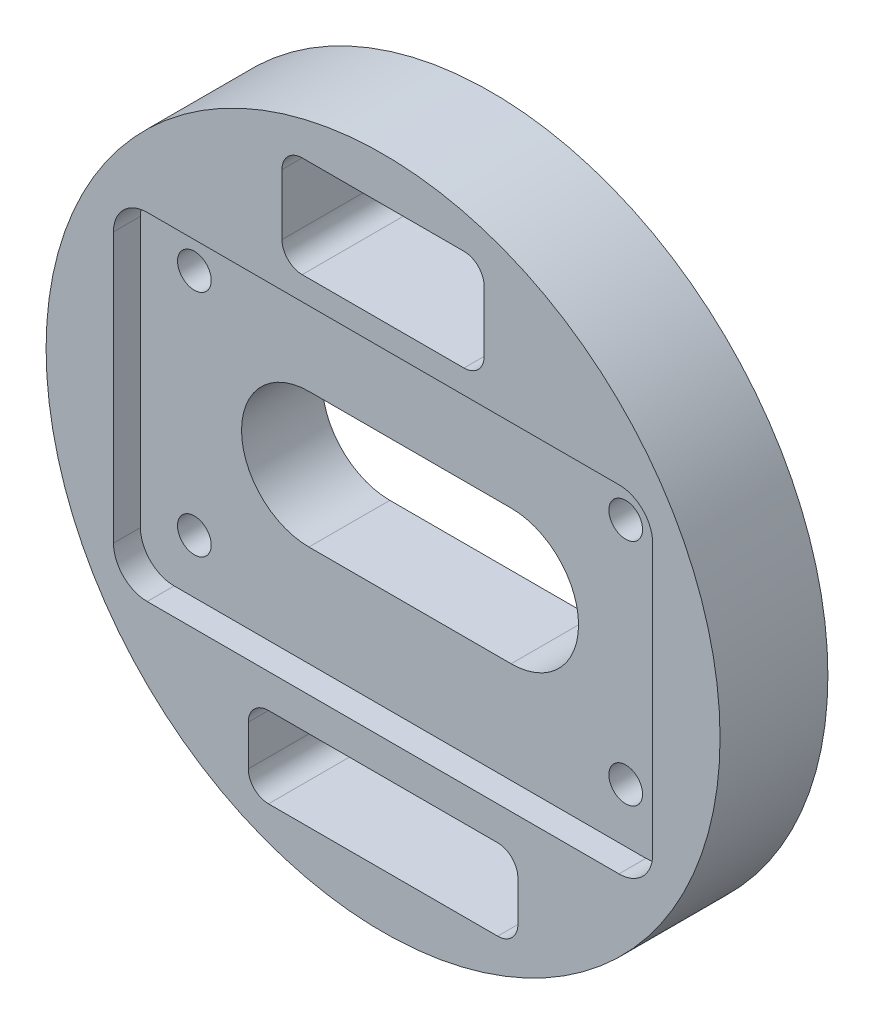
ISO-10303-21;
HEADER;
FILE_DESCRIPTION(('STEP AP214'),'2;1');
FILE_NAME('part.step','',(''),(''),'','','');
FILE_SCHEMA(('AUTOMOTIVE_DESIGN { 1 0 10303 214 1 1 1 1 }'));
ENDSEC;
DATA;
#1=APPLICATION_CONTEXT('core data for automotive mechanical design processes');
#2=APPLICATION_PROTOCOL_DEFINITION('international standard','automotive_design',2000,#1);
#3=PRODUCT_CONTEXT('',#1,'mechanical');
#4=PRODUCT('Part','Part','',(#3));
#5=PRODUCT_RELATED_PRODUCT_CATEGORY('part','',(#4));
#6=PRODUCT_DEFINITION_FORMATION('','',#4);
#7=PRODUCT_DEFINITION_CONTEXT('part definition',#1,'design');
#8=PRODUCT_DEFINITION('design','',#6,#7);
#9=PRODUCT_DEFINITION_SHAPE('','',#8);
#10=(LENGTH_UNIT() NAMED_UNIT(*) SI_UNIT(.MILLI.,.METRE.));
#11=(NAMED_UNIT(*) PLANE_ANGLE_UNIT() SI_UNIT($,.RADIAN.));
#12=(NAMED_UNIT(*) SI_UNIT($,.STERADIAN.) SOLID_ANGLE_UNIT());
#13=UNCERTAINTY_MEASURE_WITH_UNIT(LENGTH_MEASURE(1.E-05),#10,'distance_accuracy_value','');
#14=(GEOMETRIC_REPRESENTATION_CONTEXT(3) GLOBAL_UNCERTAINTY_ASSIGNED_CONTEXT((#13)) GLOBAL_UNIT_ASSIGNED_CONTEXT((#10,
#11,#12)) REPRESENTATION_CONTEXT('',''));
#15=CARTESIAN_POINT('',(0.,0.,0.));
#16=DIRECTION('',(0.,0.,1.));
#17=DIRECTION('',(1.,0.,0.));
#18=AXIS2_PLACEMENT_3D('',#15,#16,#17);
#19=CARTESIAN_POINT('',(0.,0.,-8.));
#20=DIRECTION('',(0.,0.,1.));
#21=DIRECTION('',(1.,0.,0.));
#22=AXIS2_PLACEMENT_3D('',#19,#20,#21);
#23=CYLINDRICAL_SURFACE('',#22,25.);
#24=CARTESIAN_POINT('',(0.,0.,-8.));
#25=DIRECTION('',(0.,0.,1.));
#26=DIRECTION('',(1.,0.,0.));
#27=AXIS2_PLACEMENT_3D('',#24,#25,#26);
#28=CIRCLE('',#27,25.);
#29=CARTESIAN_POINT('',(25.,0.,-8.));
#30=VERTEX_POINT('',#29);
#31=EDGE_CURVE('E497',#30,#30,#28,.T.);
#32=ORIENTED_EDGE('',*,*,#31,.T.);
#33=EDGE_LOOP('',(#32));
#34=FACE_BOUND('',#33,.T.);
#35=CARTESIAN_POINT('',(0.,0.,0.));
#36=DIRECTION('',(0.,0.,1.));
#37=DIRECTION('',(1.,0.,0.));
#38=AXIS2_PLACEMENT_3D('',#35,#36,#37);
#39=CIRCLE('',#38,25.);
#40=CARTESIAN_POINT('',(25.,0.,0.));
#41=VERTEX_POINT('',#40);
#42=EDGE_CURVE('E475',#41,#41,#39,.T.);
#43=ORIENTED_EDGE('',*,*,#42,.F.);
#44=EDGE_LOOP('',(#43));
#45=FACE_BOUND('',#44,.T.);
#46=ADVANCED_FACE('F43',(#34,#45),#23,.T.);
#47=CARTESIAN_POINT('',(0.,0.,-8.));
#48=DIRECTION('',(0.,0.,1.));
#49=DIRECTION('',(1.,0.,0.));
#50=AXIS2_PLACEMENT_3D('',#47,#48,#49);
#51=PLANE('',#50);
#52=DIRECTION('',(0.,-1.,0.));
#53=VECTOR('',#52,1.);
#54=CARTESIAN_POINT('',(-9.99999999999999,-21.,-8.));
#55=LINE('',#54,#53);
#56=CARTESIAN_POINT('',(-9.99999999999999,-16.5,-8.));
#57=VERTEX_POINT('',#56);
#58=CARTESIAN_POINT('',(-9.99999999999999,-19.5,-8.));
#59=VERTEX_POINT('',#58);
#60=EDGE_CURVE('E570',#57,#59,#55,.T.);
#61=ORIENTED_EDGE('',*,*,#60,.T.);
#62=CARTESIAN_POINT('',(-8.49999999999999,-19.5,-8.));
#63=DIRECTION('',(0.,0.,1.));
#64=DIRECTION('',(1.,0.,0.));
#65=AXIS2_PLACEMENT_3D('',#62,#63,#64);
#66=CIRCLE('',#65,1.5);
#67=CARTESIAN_POINT('',(-8.49999999999999,-21.,-8.));
#68=VERTEX_POINT('',#67);
#69=EDGE_CURVE('E540',#59,#68,#66,.T.);
#70=ORIENTED_EDGE('',*,*,#69,.T.);
#71=DIRECTION('',(1.,0.,0.));
#72=VECTOR('',#71,1.);
#73=CARTESIAN_POINT('',(-9.99999999999999,-21.,-8.));
#74=LINE('',#73,#72);
#75=CARTESIAN_POINT('',(8.50000000000001,-21.,-8.));
#76=VERTEX_POINT('',#75);
#77=EDGE_CURVE('E290',#68,#76,#74,.T.);
#78=ORIENTED_EDGE('',*,*,#77,.T.);
#79=CARTESIAN_POINT('',(8.50000000000001,-19.5,-8.));
#80=DIRECTION('',(0.,0.,1.));
#81=DIRECTION('',(1.,0.,0.));
#82=AXIS2_PLACEMENT_3D('',#79,#80,#81);
#83=CIRCLE('',#82,1.5);
#84=CARTESIAN_POINT('',(10.,-19.5,-8.));
#85=VERTEX_POINT('',#84);
#86=EDGE_CURVE('E534',#76,#85,#83,.T.);
#87=ORIENTED_EDGE('',*,*,#86,.T.);
#88=DIRECTION('',(0.,1.,0.));
#89=VECTOR('',#88,1.);
#90=CARTESIAN_POINT('',(10.,-21.,-8.));
#91=LINE('',#90,#89);
#92=CARTESIAN_POINT('',(10.,-16.5,-8.));
#93=VERTEX_POINT('',#92);
#94=EDGE_CURVE('E571',#85,#93,#91,.T.);
#95=ORIENTED_EDGE('',*,*,#94,.T.);
#96=CARTESIAN_POINT('',(8.50000000000001,-16.5,-8.));
#97=DIRECTION('',(0.,0.,1.));
#98=DIRECTION('',(1.,0.,0.));
#99=AXIS2_PLACEMENT_3D('',#96,#97,#98);
#100=CIRCLE('',#99,1.5);
#101=CARTESIAN_POINT('',(8.50000000000001,-15.,-8.));
#102=VERTEX_POINT('',#101);
#103=EDGE_CURVE('E11',#93,#102,#100,.T.);
#104=ORIENTED_EDGE('',*,*,#103,.T.);
#105=DIRECTION('',(-1.,0.,0.));
#106=VECTOR('',#105,1.);
#107=CARTESIAN_POINT('',(-9.99999999999999,-15.,-8.));
#108=LINE('',#107,#106);
#109=CARTESIAN_POINT('',(-8.49999999999999,-15.,-8.));
#110=VERTEX_POINT('',#109);
#111=EDGE_CURVE('E567',#102,#110,#108,.T.);
#112=ORIENTED_EDGE('',*,*,#111,.T.);
#113=CARTESIAN_POINT('',(-8.49999999999999,-16.5,-8.));
#114=DIRECTION('',(0.,0.,1.));
#115=DIRECTION('',(1.,0.,0.));
#116=AXIS2_PLACEMENT_3D('',#113,#114,#115);
#117=CIRCLE('',#116,1.5);
#118=EDGE_CURVE('E546',#110,#57,#117,.T.);
#119=ORIENTED_EDGE('',*,*,#118,.T.);
#120=EDGE_LOOP('',(#61,#70,#78,#87,#95,#104,#112,#119));
#121=FACE_BOUND('',#120,.T.);
#122=DIRECTION('',(1.,0.,0.));
#123=VECTOR('',#122,1.);
#124=CARTESIAN_POINT('',(6.,14.25,-8.));
#125=LINE('',#124,#123);
#126=CARTESIAN_POINT('',(-6.,14.25,-8.));
#127=VERTEX_POINT('',#126);
#128=CARTESIAN_POINT('',(6.,14.25,-8.));
#129=VERTEX_POINT('',#128);
#130=EDGE_CURVE('E242',#127,#129,#125,.T.);
#131=ORIENTED_EDGE('',*,*,#130,.T.);
#132=CARTESIAN_POINT('',(6.,15.75,-8.));
#133=DIRECTION('',(0.,0.,1.));
#134=DIRECTION('',(-1.,0.,0.));
#135=AXIS2_PLACEMENT_3D('',#132,#133,#134);
#136=CIRCLE('',#135,1.5);
#137=CARTESIAN_POINT('',(7.5,15.75,-8.));
#138=VERTEX_POINT('',#137);
#139=EDGE_CURVE('E233',#129,#138,#136,.T.);
#140=ORIENTED_EDGE('',*,*,#139,.T.);
#141=DIRECTION('',(0.,1.,0.));
#142=VECTOR('',#141,1.);
#143=CARTESIAN_POINT('',(7.5,20.25,-8.));
#144=LINE('',#143,#142);
#145=CARTESIAN_POINT('',(7.5,20.25,-8.));
#146=VERTEX_POINT('',#145);
#147=EDGE_CURVE('E246',#138,#146,#144,.T.);
#148=ORIENTED_EDGE('',*,*,#147,.T.);
#149=CARTESIAN_POINT('',(6.,20.25,-8.));
#150=DIRECTION('',(0.,0.,1.));
#151=DIRECTION('',(-1.,0.,0.));
#152=AXIS2_PLACEMENT_3D('',#149,#150,#151);
#153=CIRCLE('',#152,1.5);
#154=CARTESIAN_POINT('',(6.,21.75,-8.));
#155=VERTEX_POINT('',#154);
#156=EDGE_CURVE('E251',#146,#155,#153,.T.);
#157=ORIENTED_EDGE('',*,*,#156,.T.);
#158=DIRECTION('',(-1.,0.,0.));
#159=VECTOR('',#158,1.);
#160=CARTESIAN_POINT('',(6.,21.75,-8.));
#161=LINE('',#160,#159);
#162=CARTESIAN_POINT('',(-6.,21.75,-8.));
#163=VERTEX_POINT('',#162);
#164=EDGE_CURVE('E270',#155,#163,#161,.T.);
#165=ORIENTED_EDGE('',*,*,#164,.T.);
#166=CARTESIAN_POINT('',(-6.,20.25,-8.));
#167=DIRECTION('',(0.,0.,1.));
#168=DIRECTION('',(1.,0.,0.));
#169=AXIS2_PLACEMENT_3D('',#166,#167,#168);
#170=CIRCLE('',#169,1.5);
#171=CARTESIAN_POINT('',(-7.5,20.25,-8.));
#172=VERTEX_POINT('',#171);
#173=EDGE_CURVE('E274',#163,#172,#170,.T.);
#174=ORIENTED_EDGE('',*,*,#173,.T.);
#175=DIRECTION('',(0.,-1.,0.));
#176=VECTOR('',#175,1.);
#177=CARTESIAN_POINT('',(-7.5,20.25,-8.));
#178=LINE('',#177,#176);
#179=CARTESIAN_POINT('',(-7.5,15.75,-8.));
#180=VERTEX_POINT('',#179);
#181=EDGE_CURVE('E278',#172,#180,#178,.T.);
#182=ORIENTED_EDGE('',*,*,#181,.T.);
#183=CARTESIAN_POINT('',(-6.,15.75,-8.));
#184=DIRECTION('',(0.,0.,1.));
#185=DIRECTION('',(-1.,0.,0.));
#186=AXIS2_PLACEMENT_3D('',#183,#184,#185);
#187=CIRCLE('',#186,1.5);
#188=EDGE_CURVE('E282',#180,#127,#187,.T.);
#189=ORIENTED_EDGE('',*,*,#188,.T.);
#190=EDGE_LOOP('',(#131,#140,#148,#157,#165,#174,#182,#189));
#191=FACE_BOUND('',#190,.T.);
#192=CARTESIAN_POINT('',(16.,8.50000000000001,-8.));
#193=DIRECTION('',(0.,0.,1.));
#194=DIRECTION('',(1.,0.,0.));
#195=AXIS2_PLACEMENT_3D('',#192,#193,#194);
#196=CIRCLE('',#195,1.25);
#197=CARTESIAN_POINT('',(17.25,8.50000000000001,-8.));
#198=VERTEX_POINT('',#197);
#199=EDGE_CURVE('E336',#198,#198,#196,.T.);
#200=ORIENTED_EDGE('',*,*,#199,.T.);
#201=EDGE_LOOP('',(#200));
#202=FACE_BOUND('',#201,.T.);
#203=CARTESIAN_POINT('',(-16.,8.50000000000001,-8.));
#204=DIRECTION('',(0.,0.,1.));
#205=DIRECTION('',(1.,0.,0.));
#206=AXIS2_PLACEMENT_3D('',#203,#204,#205);
#207=CIRCLE('',#206,1.25);
#208=CARTESIAN_POINT('',(-14.75,8.50000000000001,-8.));
#209=VERTEX_POINT('',#208);
#210=EDGE_CURVE('E344',#209,#209,#207,.T.);
#211=ORIENTED_EDGE('',*,*,#210,.T.);
#212=EDGE_LOOP('',(#211));
#213=FACE_BOUND('',#212,.T.);
#214=CARTESIAN_POINT('',(-16.,-8.50000000000001,-8.));
#215=DIRECTION('',(0.,0.,1.));
#216=DIRECTION('',(1.,0.,0.));
#217=AXIS2_PLACEMENT_3D('',#214,#215,#216);
#218=CIRCLE('',#217,1.25);
#219=CARTESIAN_POINT('',(-14.75,-8.50000000000001,-8.));
#220=VERTEX_POINT('',#219);
#221=EDGE_CURVE('E352',#220,#220,#218,.T.);
#222=ORIENTED_EDGE('',*,*,#221,.T.);
#223=EDGE_LOOP('',(#222));
#224=FACE_BOUND('',#223,.T.);
#225=CARTESIAN_POINT('',(16.,-8.50000000000001,-8.));
#226=DIRECTION('',(0.,0.,1.));
#227=DIRECTION('',(1.,0.,0.));
#228=AXIS2_PLACEMENT_3D('',#225,#226,#227);
#229=CIRCLE('',#228,1.25);
#230=CARTESIAN_POINT('',(17.25,-8.50000000000001,-8.));
#231=VERTEX_POINT('',#230);
#232=EDGE_CURVE('E360',#231,#231,#229,.T.);
#233=ORIENTED_EDGE('',*,*,#232,.T.);
#234=EDGE_LOOP('',(#233));
#235=FACE_BOUND('',#234,.T.);
#236=DIRECTION('',(-1.,0.,0.));
#237=VECTOR('',#236,1.);
#238=CARTESIAN_POINT('',(-7.5,5.,-8.));
#239=LINE('',#238,#237);
#240=CARTESIAN_POINT('',(7.5,5.,-8.));
#241=VERTEX_POINT('',#240);
#242=CARTESIAN_POINT('',(-7.5,5.,-8.));
#243=VERTEX_POINT('',#242);
#244=EDGE_CURVE('E378',#241,#243,#239,.T.);
#245=ORIENTED_EDGE('',*,*,#244,.T.);
#246=CARTESIAN_POINT('',(-7.5,0.,-8.));
#247=DIRECTION('',(0.,0.,1.));
#248=DIRECTION('',(1.,0.,0.));
#249=AXIS2_PLACEMENT_3D('',#246,#247,#248);
#250=CIRCLE('',#249,5.);
#251=CARTESIAN_POINT('',(-7.5,-5.,-8.));
#252=VERTEX_POINT('',#251);
#253=EDGE_CURVE('E365',#243,#252,#250,.T.);
#254=ORIENTED_EDGE('',*,*,#253,.T.);
#255=DIRECTION('',(1.,0.,0.));
#256=VECTOR('',#255,1.);
#257=CARTESIAN_POINT('',(-7.5,-5.,-8.));
#258=LINE('',#257,#256);
#259=CARTESIAN_POINT('',(7.5,-5.,-8.));
#260=VERTEX_POINT('',#259);
#261=EDGE_CURVE('E369',#252,#260,#258,.T.);
#262=ORIENTED_EDGE('',*,*,#261,.T.);
#263=CARTESIAN_POINT('',(7.5,0.,-8.));
#264=DIRECTION('',(0.,0.,1.));
#265=DIRECTION('',(1.,0.,0.));
#266=AXIS2_PLACEMENT_3D('',#263,#264,#265);
#267=CIRCLE('',#266,5.);
#268=EDGE_CURVE('E374',#260,#241,#267,.T.);
#269=ORIENTED_EDGE('',*,*,#268,.T.);
#270=EDGE_LOOP('',(#245,#254,#262,#269));
#271=FACE_BOUND('',#270,.T.);
#272=ORIENTED_EDGE('',*,*,#31,.F.);
#273=EDGE_LOOP('',(#272));
#274=FACE_BOUND('',#273,.T.);
#275=ADVANCED_FACE('F253',(#121,#191,#202,#213,#224,#235,#271,#274),#51,.F.);
#276=CARTESIAN_POINT('',(0.,0.,0.));
#277=DIRECTION('',(0.,0.,1.));
#278=DIRECTION('',(1.,0.,0.));
#279=AXIS2_PLACEMENT_3D('',#276,#277,#278);
#280=PLANE('',#279);
#281=DIRECTION('',(0.,1.,0.));
#282=VECTOR('',#281,1.);
#283=CARTESIAN_POINT('',(10.,-21.,0.));
#284=LINE('',#283,#282);
#285=CARTESIAN_POINT('',(10.,-19.5,0.));
#286=VERTEX_POINT('',#285);
#287=CARTESIAN_POINT('',(10.,-16.5,0.));
#288=VERTEX_POINT('',#287);
#289=EDGE_CURVE('E555',#286,#288,#284,.T.);
#290=ORIENTED_EDGE('',*,*,#289,.F.);
#291=CARTESIAN_POINT('',(8.50000000000001,-19.5,0.));
#292=DIRECTION('',(0.,0.,1.));
#293=DIRECTION('',(1.,0.,0.));
#294=AXIS2_PLACEMENT_3D('',#291,#292,#293);
#295=CIRCLE('',#294,1.5);
#296=CARTESIAN_POINT('',(8.50000000000001,-21.,0.));
#297=VERTEX_POINT('',#296);
#298=EDGE_CURVE('E531',#286,#297,#295,.F.);
#299=ORIENTED_EDGE('',*,*,#298,.T.);
#300=DIRECTION('',(1.,0.,0.));
#301=VECTOR('',#300,1.);
#302=CARTESIAN_POINT('',(-9.99999999999999,-21.,0.));
#303=LINE('',#302,#301);
#304=CARTESIAN_POINT('',(-8.49999999999999,-21.,0.));
#305=VERTEX_POINT('',#304);
#306=EDGE_CURVE('E265',#305,#297,#303,.T.);
#307=ORIENTED_EDGE('',*,*,#306,.F.);
#308=CARTESIAN_POINT('',(-8.49999999999999,-19.5,0.));
#309=DIRECTION('',(0.,0.,1.));
#310=DIRECTION('',(1.,0.,0.));
#311=AXIS2_PLACEMENT_3D('',#308,#309,#310);
#312=CIRCLE('',#311,1.5);
#313=CARTESIAN_POINT('',(-9.99999999999999,-19.5,0.));
#314=VERTEX_POINT('',#313);
#315=EDGE_CURVE('E537',#305,#314,#312,.F.);
#316=ORIENTED_EDGE('',*,*,#315,.T.);
#317=DIRECTION('',(0.,-1.,0.));
#318=VECTOR('',#317,1.);
#319=CARTESIAN_POINT('',(-9.99999999999999,-21.,0.));
#320=LINE('',#319,#318);
#321=CARTESIAN_POINT('',(-9.99999999999999,-16.5,0.));
#322=VERTEX_POINT('',#321);
#323=EDGE_CURVE('E583',#322,#314,#320,.T.);
#324=ORIENTED_EDGE('',*,*,#323,.F.);
#325=CARTESIAN_POINT('',(-8.49999999999999,-16.5,0.));
#326=DIRECTION('',(0.,0.,1.));
#327=DIRECTION('',(1.,0.,0.));
#328=AXIS2_PLACEMENT_3D('',#325,#326,#327);
#329=CIRCLE('',#328,1.5);
#330=CARTESIAN_POINT('',(-8.49999999999999,-15.,0.));
#331=VERTEX_POINT('',#330);
#332=EDGE_CURVE('E543',#322,#331,#329,.F.);
#333=ORIENTED_EDGE('',*,*,#332,.T.);
#334=DIRECTION('',(-1.,0.,0.));
#335=VECTOR('',#334,1.);
#336=CARTESIAN_POINT('',(-9.99999999999999,-15.,0.));
#337=LINE('',#336,#335);
#338=CARTESIAN_POINT('',(8.50000000000001,-15.,0.));
#339=VERTEX_POINT('',#338);
#340=EDGE_CURVE('E556',#339,#331,#337,.T.);
#341=ORIENTED_EDGE('',*,*,#340,.F.);
#342=CARTESIAN_POINT('',(8.50000000000001,-16.5,0.));
#343=DIRECTION('',(0.,0.,1.));
#344=DIRECTION('',(1.,0.,0.));
#345=AXIS2_PLACEMENT_3D('',#342,#343,#344);
#346=CIRCLE('',#345,1.5);
#347=EDGE_CURVE('E52',#339,#288,#346,.F.);
#348=ORIENTED_EDGE('',*,*,#347,.T.);
#349=EDGE_LOOP('',(#290,#299,#307,#316,#324,#333,#341,#348));
#350=FACE_BOUND('',#349,.T.);
#351=CARTESIAN_POINT('',(6.,15.75,0.));
#352=DIRECTION('',(0.,0.,1.));
#353=DIRECTION('',(-1.,0.,0.));
#354=AXIS2_PLACEMENT_3D('',#351,#352,#353);
#355=CIRCLE('',#354,1.5);
#356=CARTESIAN_POINT('',(6.,14.25,0.));
#357=VERTEX_POINT('',#356);
#358=CARTESIAN_POINT('',(7.5,15.75,0.));
#359=VERTEX_POINT('',#358);
#360=EDGE_CURVE('E236',#357,#359,#355,.T.);
#361=ORIENTED_EDGE('',*,*,#360,.F.);
#362=DIRECTION('',(1.,0.,0.));
#363=VECTOR('',#362,1.);
#364=CARTESIAN_POINT('',(6.,14.25,0.));
#365=LINE('',#364,#363);
#366=CARTESIAN_POINT('',(-6.,14.25,0.));
#367=VERTEX_POINT('',#366);
#368=EDGE_CURVE('E258',#367,#357,#365,.T.);
#369=ORIENTED_EDGE('',*,*,#368,.F.);
#370=CARTESIAN_POINT('',(-6.,15.75,0.));
#371=DIRECTION('',(0.,0.,1.));
#372=DIRECTION('',(-1.,0.,0.));
#373=AXIS2_PLACEMENT_3D('',#370,#371,#372);
#374=CIRCLE('',#373,1.5);
#375=CARTESIAN_POINT('',(-7.5,15.75,0.));
#376=VERTEX_POINT('',#375);
#377=EDGE_CURVE('E262',#376,#367,#374,.T.);
#378=ORIENTED_EDGE('',*,*,#377,.F.);
#379=DIRECTION('',(0.,-1.,0.));
#380=VECTOR('',#379,1.);
#381=CARTESIAN_POINT('',(-7.5,20.25,0.));
#382=LINE('',#381,#380);
#383=CARTESIAN_POINT('',(-7.5,20.25,0.));
#384=VERTEX_POINT('',#383);
#385=EDGE_CURVE('E305',#384,#376,#382,.T.);
#386=ORIENTED_EDGE('',*,*,#385,.F.);
#387=CARTESIAN_POINT('',(-6.,20.25,0.));
#388=DIRECTION('',(0.,0.,1.));
#389=DIRECTION('',(1.,0.,0.));
#390=AXIS2_PLACEMENT_3D('',#387,#388,#389);
#391=CIRCLE('',#390,1.5);
#392=CARTESIAN_POINT('',(-6.,21.75,0.));
#393=VERTEX_POINT('',#392);
#394=EDGE_CURVE('E301',#393,#384,#391,.T.);
#395=ORIENTED_EDGE('',*,*,#394,.F.);
#396=DIRECTION('',(-1.,0.,0.));
#397=VECTOR('',#396,1.);
#398=CARTESIAN_POINT('',(6.,21.75,0.));
#399=LINE('',#398,#397);
#400=CARTESIAN_POINT('',(6.,21.75,0.));
#401=VERTEX_POINT('',#400);
#402=EDGE_CURVE('E297',#401,#393,#399,.T.);
#403=ORIENTED_EDGE('',*,*,#402,.F.);
#404=CARTESIAN_POINT('',(6.,20.25,0.));
#405=DIRECTION('',(0.,0.,1.));
#406=DIRECTION('',(-1.,0.,0.));
#407=AXIS2_PLACEMENT_3D('',#404,#405,#406);
#408=CIRCLE('',#407,1.5);
#409=CARTESIAN_POINT('',(7.5,20.25,0.));
#410=VERTEX_POINT('',#409);
#411=EDGE_CURVE('E293',#410,#401,#408,.T.);
#412=ORIENTED_EDGE('',*,*,#411,.F.);
#413=DIRECTION('',(0.,1.,0.));
#414=VECTOR('',#413,1.);
#415=CARTESIAN_POINT('',(7.5,20.25,0.));
#416=LINE('',#415,#414);
#417=EDGE_CURVE('E289',#359,#410,#416,.T.);
#418=ORIENTED_EDGE('',*,*,#417,.F.);
#419=EDGE_LOOP('',(#361,#369,#378,#386,#395,#403,#412,#418));
#420=FACE_BOUND('',#419,.T.);
#421=CARTESIAN_POINT('',(17.5,-9.99999999999999,0.));
#422=DIRECTION('',(0.,0.,1.));
#423=DIRECTION('',(1.,0.,0.));
#424=AXIS2_PLACEMENT_3D('',#421,#422,#423);
#425=CIRCLE('',#424,2.5);
#426=CARTESIAN_POINT('',(17.5,-12.5,0.));
#427=VERTEX_POINT('',#426);
#428=CARTESIAN_POINT('',(20.,-9.99999999999999,0.));
#429=VERTEX_POINT('',#428);
#430=EDGE_CURVE('E399',#427,#429,#425,.T.);
#431=ORIENTED_EDGE('',*,*,#430,.F.);
#432=DIRECTION('',(1.,0.,0.));
#433=VECTOR('',#432,1.);
#434=CARTESIAN_POINT('',(-17.5,-12.5,0.));
#435=LINE('',#434,#433);
#436=CARTESIAN_POINT('',(-17.5,-12.5,0.));
#437=VERTEX_POINT('',#436);
#438=EDGE_CURVE('E414',#437,#427,#435,.T.);
#439=ORIENTED_EDGE('',*,*,#438,.F.);
#440=CARTESIAN_POINT('',(-17.5,-9.99999999999999,0.));
#441=DIRECTION('',(0.,0.,1.));
#442=DIRECTION('',(1.,0.,0.));
#443=AXIS2_PLACEMENT_3D('',#440,#441,#442);
#444=CIRCLE('',#443,2.5);
#445=CARTESIAN_POINT('',(-20.,-9.99999999999999,0.));
#446=VERTEX_POINT('',#445);
#447=EDGE_CURVE('E465',#446,#437,#444,.T.);
#448=ORIENTED_EDGE('',*,*,#447,.F.);
#449=DIRECTION('',(0.,-1.,0.));
#450=VECTOR('',#449,1.);
#451=CARTESIAN_POINT('',(-20.,10.,0.));
#452=LINE('',#451,#450);
#453=CARTESIAN_POINT('',(-20.,10.,0.));
#454=VERTEX_POINT('',#453);
#455=EDGE_CURVE('E461',#454,#446,#452,.T.);
#456=ORIENTED_EDGE('',*,*,#455,.F.);
#457=CARTESIAN_POINT('',(-17.5,10.,0.));
#458=DIRECTION('',(0.,0.,1.));
#459=DIRECTION('',(1.,0.,0.));
#460=AXIS2_PLACEMENT_3D('',#457,#458,#459);
#461=CIRCLE('',#460,2.5);
#462=CARTESIAN_POINT('',(-17.5,12.5,0.));
#463=VERTEX_POINT('',#462);
#464=EDGE_CURVE('E457',#463,#454,#461,.T.);
#465=ORIENTED_EDGE('',*,*,#464,.F.);
#466=DIRECTION('',(-1.,0.,0.));
#467=VECTOR('',#466,1.);
#468=CARTESIAN_POINT('',(-17.5,12.5,0.));
#469=LINE('',#468,#467);
#470=CARTESIAN_POINT('',(17.5,12.5,0.));
#471=VERTEX_POINT('',#470);
#472=EDGE_CURVE('E453',#471,#463,#469,.T.);
#473=ORIENTED_EDGE('',*,*,#472,.F.);
#474=CARTESIAN_POINT('',(17.5,10.,0.));
#475=DIRECTION('',(0.,0.,1.));
#476=DIRECTION('',(-1.,0.,0.));
#477=AXIS2_PLACEMENT_3D('',#474,#475,#476);
#478=CIRCLE('',#477,2.5);
#479=CARTESIAN_POINT('',(20.,10.,0.));
#480=VERTEX_POINT('',#479);
#481=EDGE_CURVE('E449',#480,#471,#478,.T.);
#482=ORIENTED_EDGE('',*,*,#481,.F.);
#483=DIRECTION('',(0.,1.,0.));
#484=VECTOR('',#483,1.);
#485=CARTESIAN_POINT('',(20.,10.,0.));
#486=LINE('',#485,#484);
#487=EDGE_CURVE('E445',#429,#480,#486,.T.);
#488=ORIENTED_EDGE('',*,*,#487,.F.);
#489=EDGE_LOOP('',(#431,#439,#448,#456,#465,#473,#482,#488));
#490=FACE_BOUND('',#489,.T.);
#491=ORIENTED_EDGE('',*,*,#42,.T.);
#492=EDGE_LOOP('',(#491));
#493=FACE_BOUND('',#492,.T.);
#494=ADVANCED_FACE('F553',(#350,#420,#490,#493),#280,.T.);
#495=CARTESIAN_POINT('',(17.5,-9.99999999999999,-2.));
#496=DIRECTION('',(0.,0.,1.));
#497=DIRECTION('',(1.,0.,0.));
#498=AXIS2_PLACEMENT_3D('',#495,#496,#497);
#499=CYLINDRICAL_SURFACE('',#498,2.5);
#500=ORIENTED_EDGE('',*,*,#430,.T.);
#501=DIRECTION('',(0.,0.,1.));
#502=VECTOR('',#501,1.);
#503=CARTESIAN_POINT('',(20.,-9.99999999999999,-2.));
#504=LINE('',#503,#502);
#505=CARTESIAN_POINT('',(20.,-9.99999999999999,-2.));
#506=VERTEX_POINT('',#505);
#507=EDGE_CURVE('E442',#506,#429,#504,.T.);
#508=ORIENTED_EDGE('',*,*,#507,.F.);
#509=CARTESIAN_POINT('',(17.5,-9.99999999999999,-2.));
#510=DIRECTION('',(0.,0.,1.));
#511=DIRECTION('',(1.,0.,0.));
#512=AXIS2_PLACEMENT_3D('',#509,#510,#511);
#513=CIRCLE('',#512,2.5);
#514=CARTESIAN_POINT('',(17.5,-12.5,-2.));
#515=VERTEX_POINT('',#514);
#516=EDGE_CURVE('E409',#515,#506,#513,.T.);
#517=ORIENTED_EDGE('',*,*,#516,.F.);
#518=DIRECTION('',(0.,0.,1.));
#519=VECTOR('',#518,1.);
#520=CARTESIAN_POINT('',(17.5,-12.5,-2.));
#521=LINE('',#520,#519);
#522=EDGE_CURVE('E472',#515,#427,#521,.T.);
#523=ORIENTED_EDGE('',*,*,#522,.T.);
#524=EDGE_LOOP('',(#500,#508,#517,#523));
#525=FACE_BOUND('',#524,.T.);
#526=ADVANCED_FACE('F844',(#525),#499,.F.);
#527=CARTESIAN_POINT('',(-17.5,-12.5,-2.));
#528=DIRECTION('',(0.,-1.,0.));
#529=DIRECTION('',(0.,0.,-1.));
#530=AXIS2_PLACEMENT_3D('',#527,#528,#529);
#531=PLANE('',#530);
#532=ORIENTED_EDGE('',*,*,#438,.T.);
#533=ORIENTED_EDGE('',*,*,#522,.F.);
#534=DIRECTION('',(1.,0.,0.));
#535=VECTOR('',#534,1.);
#536=CARTESIAN_POINT('',(-17.5,-12.5,-2.));
#537=LINE('',#536,#535);
#538=CARTESIAN_POINT('',(-17.5,-12.5,-2.));
#539=VERTEX_POINT('',#538);
#540=EDGE_CURVE('E438',#539,#515,#537,.T.);
#541=ORIENTED_EDGE('',*,*,#540,.F.);
#542=DIRECTION('',(0.,0.,1.));
#543=VECTOR('',#542,1.);
#544=CARTESIAN_POINT('',(-17.5,-12.5,-2.));
#545=LINE('',#544,#543);
#546=EDGE_CURVE('E476',#539,#437,#545,.T.);
#547=ORIENTED_EDGE('',*,*,#546,.T.);
#548=EDGE_LOOP('',(#532,#533,#541,#547));
#549=FACE_BOUND('',#548,.T.);
#550=ADVANCED_FACE('F821',(#549),#531,.F.);
#551=CARTESIAN_POINT('',(-17.5,-9.99999999999999,-2.));
#552=DIRECTION('',(0.,0.,1.));
#553=DIRECTION('',(1.,0.,0.));
#554=AXIS2_PLACEMENT_3D('',#551,#552,#553);
#555=CYLINDRICAL_SURFACE('',#554,2.5);
#556=ORIENTED_EDGE('',*,*,#447,.T.);
#557=ORIENTED_EDGE('',*,*,#546,.F.);
#558=CARTESIAN_POINT('',(-17.5,-9.99999999999999,-2.));
#559=DIRECTION('',(0.,0.,1.));
#560=DIRECTION('',(1.,0.,0.));
#561=AXIS2_PLACEMENT_3D('',#558,#559,#560);
#562=CIRCLE('',#561,2.5);
#563=CARTESIAN_POINT('',(-20.,-9.99999999999999,-2.));
#564=VERTEX_POINT('',#563);
#565=EDGE_CURVE('E434',#564,#539,#562,.T.);
#566=ORIENTED_EDGE('',*,*,#565,.F.);
#567=DIRECTION('',(0.,0.,1.));
#568=VECTOR('',#567,1.);
#569=CARTESIAN_POINT('',(-20.,-9.99999999999999,-2.));
#570=LINE('',#569,#568);
#571=EDGE_CURVE('E479',#564,#446,#570,.T.);
#572=ORIENTED_EDGE('',*,*,#571,.T.);
#573=EDGE_LOOP('',(#556,#557,#566,#572));
#574=FACE_BOUND('',#573,.T.);
#575=ADVANCED_FACE('F815',(#574),#555,.F.);
#576=CARTESIAN_POINT('',(-20.,10.,-2.));
#577=DIRECTION('',(-1.,0.,0.));
#578=DIRECTION('',(0.,-1.,0.));
#579=AXIS2_PLACEMENT_3D('',#576,#577,#578);
#580=PLANE('',#579);
#581=ORIENTED_EDGE('',*,*,#455,.T.);
#582=ORIENTED_EDGE('',*,*,#571,.F.);
#583=DIRECTION('',(0.,-1.,0.));
#584=VECTOR('',#583,1.);
#585=CARTESIAN_POINT('',(-20.,10.,-2.));
#586=LINE('',#585,#584);
#587=CARTESIAN_POINT('',(-20.,10.,-2.));
#588=VERTEX_POINT('',#587);
#589=EDGE_CURVE('E430',#588,#564,#586,.T.);
#590=ORIENTED_EDGE('',*,*,#589,.F.);
#591=DIRECTION('',(0.,0.,1.));
#592=VECTOR('',#591,1.);
#593=CARTESIAN_POINT('',(-20.,10.,-2.));
#594=LINE('',#593,#592);
#595=EDGE_CURVE('E482',#588,#454,#594,.T.);
#596=ORIENTED_EDGE('',*,*,#595,.T.);
#597=EDGE_LOOP('',(#581,#582,#590,#596));
#598=FACE_BOUND('',#597,.T.);
#599=ADVANCED_FACE('F820',(#598),#580,.F.);
#600=CARTESIAN_POINT('',(-17.5,10.,-2.));
#601=DIRECTION('',(0.,0.,1.));
#602=DIRECTION('',(1.,0.,0.));
#603=AXIS2_PLACEMENT_3D('',#600,#601,#602);
#604=CYLINDRICAL_SURFACE('',#603,2.5);
#605=ORIENTED_EDGE('',*,*,#464,.T.);
#606=ORIENTED_EDGE('',*,*,#595,.F.);
#607=CARTESIAN_POINT('',(-17.5,10.,-2.));
#608=DIRECTION('',(0.,0.,1.));
#609=DIRECTION('',(1.,0.,0.));
#610=AXIS2_PLACEMENT_3D('',#607,#608,#609);
#611=CIRCLE('',#610,2.5);
#612=CARTESIAN_POINT('',(-17.5,12.5,-2.));
#613=VERTEX_POINT('',#612);
#614=EDGE_CURVE('E426',#613,#588,#611,.T.);
#615=ORIENTED_EDGE('',*,*,#614,.F.);
#616=DIRECTION('',(0.,0.,1.));
#617=VECTOR('',#616,1.);
#618=CARTESIAN_POINT('',(-17.5,12.5,-2.));
#619=LINE('',#618,#617);
#620=EDGE_CURVE('E485',#613,#463,#619,.T.);
#621=ORIENTED_EDGE('',*,*,#620,.T.);
#622=EDGE_LOOP('',(#605,#606,#615,#621));
#623=FACE_BOUND('',#622,.T.);
#624=ADVANCED_FACE('F831',(#623),#604,.F.);
#625=CARTESIAN_POINT('',(-17.5,12.5,-2.));
#626=DIRECTION('',(0.,1.,0.));
#627=DIRECTION('',(0.,0.,1.));
#628=AXIS2_PLACEMENT_3D('',#625,#626,#627);
#629=PLANE('',#628);
#630=ORIENTED_EDGE('',*,*,#472,.T.);
#631=ORIENTED_EDGE('',*,*,#620,.F.);
#632=DIRECTION('',(-1.,0.,0.));
#633=VECTOR('',#632,1.);
#634=CARTESIAN_POINT('',(-17.5,12.5,-2.));
#635=LINE('',#634,#633);
#636=CARTESIAN_POINT('',(17.5,12.5,-2.));
#637=VERTEX_POINT('',#636);
#638=EDGE_CURVE('E422',#637,#613,#635,.T.);
#639=ORIENTED_EDGE('',*,*,#638,.F.);
#640=DIRECTION('',(0.,0.,1.));
#641=VECTOR('',#640,1.);
#642=CARTESIAN_POINT('',(17.5,12.5,-2.));
#643=LINE('',#642,#641);
#644=EDGE_CURVE('E488',#637,#471,#643,.T.);
#645=ORIENTED_EDGE('',*,*,#644,.T.);
#646=EDGE_LOOP('',(#630,#631,#639,#645));
#647=FACE_BOUND('',#646,.T.);
#648=ADVANCED_FACE('F836',(#647),#629,.F.);
#649=CARTESIAN_POINT('',(17.5,10.,-2.));
#650=DIRECTION('',(0.,0.,1.));
#651=DIRECTION('',(1.,0.,0.));
#652=AXIS2_PLACEMENT_3D('',#649,#650,#651);
#653=CYLINDRICAL_SURFACE('',#652,2.5);
#654=ORIENTED_EDGE('',*,*,#481,.T.);
#655=ORIENTED_EDGE('',*,*,#644,.F.);
#656=CARTESIAN_POINT('',(17.5,10.,-2.));
#657=DIRECTION('',(0.,0.,1.));
#658=DIRECTION('',(-1.,0.,0.));
#659=AXIS2_PLACEMENT_3D('',#656,#657,#658);
#660=CIRCLE('',#659,2.5);
#661=CARTESIAN_POINT('',(20.,10.,-2.));
#662=VERTEX_POINT('',#661);
#663=EDGE_CURVE('E418',#662,#637,#660,.T.);
#664=ORIENTED_EDGE('',*,*,#663,.F.);
#665=DIRECTION('',(0.,0.,1.));
#666=VECTOR('',#665,1.);
#667=CARTESIAN_POINT('',(20.,10.,-2.));
#668=LINE('',#667,#666);
#669=EDGE_CURVE('E491',#662,#480,#668,.T.);
#670=ORIENTED_EDGE('',*,*,#669,.T.);
#671=EDGE_LOOP('',(#654,#655,#664,#670));
#672=FACE_BOUND('',#671,.T.);
#673=ADVANCED_FACE('F855',(#672),#653,.F.);
#674=CARTESIAN_POINT('',(20.,10.,-2.));
#675=DIRECTION('',(1.,0.,0.));
#676=DIRECTION('',(0.,1.,0.));
#677=AXIS2_PLACEMENT_3D('',#674,#675,#676);
#678=PLANE('',#677);
#679=ORIENTED_EDGE('',*,*,#487,.T.);
#680=ORIENTED_EDGE('',*,*,#669,.F.);
#681=DIRECTION('',(0.,1.,0.));
#682=VECTOR('',#681,1.);
#683=CARTESIAN_POINT('',(20.,10.,-2.));
#684=LINE('',#683,#682);
#685=EDGE_CURVE('E413',#506,#662,#684,.T.);
#686=ORIENTED_EDGE('',*,*,#685,.F.);
#687=ORIENTED_EDGE('',*,*,#507,.T.);
#688=EDGE_LOOP('',(#679,#680,#686,#687));
#689=FACE_BOUND('',#688,.T.);
#690=ADVANCED_FACE('F860',(#689),#678,.F.);
#691=CARTESIAN_POINT('',(17.5,-9.99999999999999,-2.));
#692=DIRECTION('',(0.,0.,1.));
#693=DIRECTION('',(1.,0.,0.));
#694=AXIS2_PLACEMENT_3D('',#691,#692,#693);
#695=PLANE('',#694);
#696=CARTESIAN_POINT('',(16.,8.50000000000001,-2.));
#697=DIRECTION('',(0.,0.,1.));
#698=DIRECTION('',(1.,0.,0.));
#699=AXIS2_PLACEMENT_3D('',#696,#697,#698);
#700=CIRCLE('',#699,1.25);
#701=CARTESIAN_POINT('',(17.25,8.50000000000001,-2.));
#702=VERTEX_POINT('',#701);
#703=EDGE_CURVE('E315',#702,#702,#700,.T.);
#704=ORIENTED_EDGE('',*,*,#703,.F.);
#705=EDGE_LOOP('',(#704));
#706=FACE_BOUND('',#705,.T.);
#707=CARTESIAN_POINT('',(-16.,8.50000000000001,-2.));
#708=DIRECTION('',(0.,0.,1.));
#709=DIRECTION('',(1.,0.,0.));
#710=AXIS2_PLACEMENT_3D('',#707,#708,#709);
#711=CIRCLE('',#710,1.25);
#712=CARTESIAN_POINT('',(-14.75,8.50000000000001,-2.));
#713=VERTEX_POINT('',#712);
#714=EDGE_CURVE('E340',#713,#713,#711,.T.);
#715=ORIENTED_EDGE('',*,*,#714,.F.);
#716=EDGE_LOOP('',(#715));
#717=FACE_BOUND('',#716,.T.);
#718=CARTESIAN_POINT('',(-16.,-8.50000000000001,-2.));
#719=DIRECTION('',(0.,0.,1.));
#720=DIRECTION('',(1.,0.,0.));
#721=AXIS2_PLACEMENT_3D('',#718,#719,#720);
#722=CIRCLE('',#721,1.25);
#723=CARTESIAN_POINT('',(-14.75,-8.50000000000001,-2.));
#724=VERTEX_POINT('',#723);
#725=EDGE_CURVE('E348',#724,#724,#722,.T.);
#726=ORIENTED_EDGE('',*,*,#725,.F.);
#727=EDGE_LOOP('',(#726));
#728=FACE_BOUND('',#727,.T.);
#729=CARTESIAN_POINT('',(16.,-8.50000000000001,-2.));
#730=DIRECTION('',(0.,0.,1.));
#731=DIRECTION('',(1.,0.,0.));
#732=AXIS2_PLACEMENT_3D('',#729,#730,#731);
#733=CIRCLE('',#732,1.25);
#734=CARTESIAN_POINT('',(17.25,-8.50000000000001,-2.));
#735=VERTEX_POINT('',#734);
#736=EDGE_CURVE('E356',#735,#735,#733,.T.);
#737=ORIENTED_EDGE('',*,*,#736,.F.);
#738=EDGE_LOOP('',(#737));
#739=FACE_BOUND('',#738,.T.);
#740=CARTESIAN_POINT('',(-7.5,0.,-2.));
#741=DIRECTION('',(0.,0.,1.));
#742=DIRECTION('',(1.,0.,0.));
#743=AXIS2_PLACEMENT_3D('',#740,#741,#742);
#744=CIRCLE('',#743,5.);
#745=CARTESIAN_POINT('',(-7.5,5.,-2.));
#746=VERTEX_POINT('',#745);
#747=CARTESIAN_POINT('',(-7.5,-5.,-2.));
#748=VERTEX_POINT('',#747);
#749=EDGE_CURVE('E364',#746,#748,#744,.T.);
#750=ORIENTED_EDGE('',*,*,#749,.F.);
#751=DIRECTION('',(-1.,0.,0.));
#752=VECTOR('',#751,1.);
#753=CARTESIAN_POINT('',(-7.5,5.,-2.));
#754=LINE('',#753,#752);
#755=CARTESIAN_POINT('',(7.5,5.,-2.));
#756=VERTEX_POINT('',#755);
#757=EDGE_CURVE('E370',#756,#746,#754,.T.);
#758=ORIENTED_EDGE('',*,*,#757,.F.);
#759=CARTESIAN_POINT('',(7.5,0.,-2.));
#760=DIRECTION('',(0.,0.,1.));
#761=DIRECTION('',(1.,0.,0.));
#762=AXIS2_PLACEMENT_3D('',#759,#760,#761);
#763=CIRCLE('',#762,5.);
#764=CARTESIAN_POINT('',(7.5,-5.,-2.));
#765=VERTEX_POINT('',#764);
#766=EDGE_CURVE('E389',#765,#756,#763,.T.);
#767=ORIENTED_EDGE('',*,*,#766,.F.);
#768=DIRECTION('',(1.,0.,0.));
#769=VECTOR('',#768,1.);
#770=CARTESIAN_POINT('',(-7.5,-5.,-2.));
#771=LINE('',#770,#769);
#772=EDGE_CURVE('E385',#748,#765,#771,.T.);
#773=ORIENTED_EDGE('',*,*,#772,.F.);
#774=EDGE_LOOP('',(#750,#758,#767,#773));
#775=FACE_BOUND('',#774,.T.);
#776=ORIENTED_EDGE('',*,*,#516,.T.);
#777=ORIENTED_EDGE('',*,*,#685,.T.);
#778=ORIENTED_EDGE('',*,*,#663,.T.);
#779=ORIENTED_EDGE('',*,*,#638,.T.);
#780=ORIENTED_EDGE('',*,*,#614,.T.);
#781=ORIENTED_EDGE('',*,*,#589,.T.);
#782=ORIENTED_EDGE('',*,*,#565,.T.);
#783=ORIENTED_EDGE('',*,*,#540,.T.);
#784=EDGE_LOOP('',(#776,#777,#778,#779,#780,#781,#782,#783));
#785=FACE_BOUND('',#784,.T.);
#786=ADVANCED_FACE('F724',(#706,#717,#728,#739,#775,#785),#695,.T.);
#787=CARTESIAN_POINT('',(-7.5,0.,-8.));
#788=DIRECTION('',(0.,0.,1.));
#789=DIRECTION('',(1.,0.,0.));
#790=AXIS2_PLACEMENT_3D('',#787,#788,#789);
#791=CYLINDRICAL_SURFACE('',#790,5.);
#792=ORIENTED_EDGE('',*,*,#749,.T.);
#793=DIRECTION('',(0.,0.,1.));
#794=VECTOR('',#793,1.);
#795=CARTESIAN_POINT('',(-7.5,-5.,-8.));
#796=LINE('',#795,#794);
#797=EDGE_CURVE('E382',#252,#748,#796,.T.);
#798=ORIENTED_EDGE('',*,*,#797,.F.);
#799=ORIENTED_EDGE('',*,*,#253,.F.);
#800=DIRECTION('',(0.,0.,1.));
#801=VECTOR('',#800,1.);
#802=CARTESIAN_POINT('',(-7.5,5.,-8.));
#803=LINE('',#802,#801);
#804=EDGE_CURVE('E396',#243,#746,#803,.T.);
#805=ORIENTED_EDGE('',*,*,#804,.T.);
#806=EDGE_LOOP('',(#792,#798,#799,#805));
#807=FACE_BOUND('',#806,.T.);
#808=ADVANCED_FACE('F714',(#807),#791,.F.);
#809=CARTESIAN_POINT('',(-7.5,5.,-8.));
#810=DIRECTION('',(0.,1.,0.));
#811=DIRECTION('',(0.,0.,1.));
#812=AXIS2_PLACEMENT_3D('',#809,#810,#811);
#813=PLANE('',#812);
#814=ORIENTED_EDGE('',*,*,#757,.T.);
#815=ORIENTED_EDGE('',*,*,#804,.F.);
#816=ORIENTED_EDGE('',*,*,#244,.F.);
#817=DIRECTION('',(0.,0.,1.));
#818=VECTOR('',#817,1.);
#819=CARTESIAN_POINT('',(7.5,5.,-8.));
#820=LINE('',#819,#818);
#821=EDGE_CURVE('E400',#241,#756,#820,.T.);
#822=ORIENTED_EDGE('',*,*,#821,.T.);
#823=EDGE_LOOP('',(#814,#815,#816,#822));
#824=FACE_BOUND('',#823,.T.);
#825=ADVANCED_FACE('F704',(#824),#813,.F.);
#826=CARTESIAN_POINT('',(7.5,0.,-8.));
#827=DIRECTION('',(0.,0.,1.));
#828=DIRECTION('',(1.,0.,0.));
#829=AXIS2_PLACEMENT_3D('',#826,#827,#828);
#830=CYLINDRICAL_SURFACE('',#829,5.);
#831=ORIENTED_EDGE('',*,*,#766,.T.);
#832=ORIENTED_EDGE('',*,*,#821,.F.);
#833=ORIENTED_EDGE('',*,*,#268,.F.);
#834=DIRECTION('',(0.,0.,1.));
#835=VECTOR('',#834,1.);
#836=CARTESIAN_POINT('',(7.5,-5.,-8.));
#837=LINE('',#836,#835);
#838=EDGE_CURVE('E403',#260,#765,#837,.T.);
#839=ORIENTED_EDGE('',*,*,#838,.T.);
#840=EDGE_LOOP('',(#831,#832,#833,#839));
#841=FACE_BOUND('',#840,.T.);
#842=ADVANCED_FACE('F692',(#841),#830,.F.);
#843=CARTESIAN_POINT('',(-7.5,-5.,-8.));
#844=DIRECTION('',(0.,-1.,0.));
#845=DIRECTION('',(0.,0.,-1.));
#846=AXIS2_PLACEMENT_3D('',#843,#844,#845);
#847=PLANE('',#846);
#848=ORIENTED_EDGE('',*,*,#772,.T.);
#849=ORIENTED_EDGE('',*,*,#838,.F.);
#850=ORIENTED_EDGE('',*,*,#261,.F.);
#851=ORIENTED_EDGE('',*,*,#797,.T.);
#852=EDGE_LOOP('',(#848,#849,#850,#851));
#853=FACE_BOUND('',#852,.T.);
#854=ADVANCED_FACE('F686',(#853),#847,.F.);
#855=CARTESIAN_POINT('',(16.,-8.50000000000001,-2.));
#856=DIRECTION('',(0.,0.,1.));
#857=DIRECTION('',(1.,0.,0.));
#858=AXIS2_PLACEMENT_3D('',#855,#856,#857);
#859=CYLINDRICAL_SURFACE('',#858,1.25);
#860=ORIENTED_EDGE('',*,*,#232,.F.);
#861=EDGE_LOOP('',(#860));
#862=FACE_BOUND('',#861,.T.);
#863=ORIENTED_EDGE('',*,*,#736,.T.);
#864=EDGE_LOOP('',(#863));
#865=FACE_BOUND('',#864,.T.);
#866=ADVANCED_FACE('F691',(#862,#865),#859,.F.);
#867=CARTESIAN_POINT('',(-16.,-8.50000000000001,-2.));
#868=DIRECTION('',(0.,0.,1.));
#869=DIRECTION('',(1.,0.,0.));
#870=AXIS2_PLACEMENT_3D('',#867,#868,#869);
#871=CYLINDRICAL_SURFACE('',#870,1.25);
#872=ORIENTED_EDGE('',*,*,#221,.F.);
#873=EDGE_LOOP('',(#872));
#874=FACE_BOUND('',#873,.T.);
#875=ORIENTED_EDGE('',*,*,#725,.T.);
#876=EDGE_LOOP('',(#875));
#877=FACE_BOUND('',#876,.T.);
#878=ADVANCED_FACE('F915',(#874,#877),#871,.F.);
#879=CARTESIAN_POINT('',(-16.,8.50000000000001,-2.));
#880=DIRECTION('',(0.,0.,1.));
#881=DIRECTION('',(1.,0.,0.));
#882=AXIS2_PLACEMENT_3D('',#879,#880,#881);
#883=CYLINDRICAL_SURFACE('',#882,1.25);
#884=ORIENTED_EDGE('',*,*,#210,.F.);
#885=EDGE_LOOP('',(#884));
#886=FACE_BOUND('',#885,.T.);
#887=ORIENTED_EDGE('',*,*,#714,.T.);
#888=EDGE_LOOP('',(#887));
#889=FACE_BOUND('',#888,.T.);
#890=ADVANCED_FACE('F905',(#886,#889),#883,.F.);
#891=CARTESIAN_POINT('',(16.,8.50000000000001,-2.));
#892=DIRECTION('',(0.,0.,1.));
#893=DIRECTION('',(1.,0.,0.));
#894=AXIS2_PLACEMENT_3D('',#891,#892,#893);
#895=CYLINDRICAL_SURFACE('',#894,1.25);
#896=ORIENTED_EDGE('',*,*,#199,.F.);
#897=EDGE_LOOP('',(#896));
#898=FACE_BOUND('',#897,.T.);
#899=ORIENTED_EDGE('',*,*,#703,.T.);
#900=EDGE_LOOP('',(#899));
#901=FACE_BOUND('',#900,.T.);
#902=ADVANCED_FACE('F778',(#898,#901),#895,.F.);
#903=CARTESIAN_POINT('',(6.,15.75,-8.));
#904=DIRECTION('',(0.,0.,1.));
#905=DIRECTION('',(1.,0.,0.));
#906=AXIS2_PLACEMENT_3D('',#903,#904,#905);
#907=CYLINDRICAL_SURFACE('',#906,1.5);
#908=ORIENTED_EDGE('',*,*,#360,.T.);
#909=DIRECTION('',(0.,0.,1.));
#910=VECTOR('',#909,1.);
#911=CARTESIAN_POINT('',(7.5,15.75,-8.));
#912=LINE('',#911,#910);
#913=EDGE_CURVE('E229',#138,#359,#912,.T.);
#914=ORIENTED_EDGE('',*,*,#913,.F.);
#915=ORIENTED_EDGE('',*,*,#139,.F.);
#916=DIRECTION('',(0.,0.,1.));
#917=VECTOR('',#916,1.);
#918=CARTESIAN_POINT('',(6.,14.25,-8.));
#919=LINE('',#918,#917);
#920=EDGE_CURVE('E312',#129,#357,#919,.T.);
#921=ORIENTED_EDGE('',*,*,#920,.T.);
#922=EDGE_LOOP('',(#908,#914,#915,#921));
#923=FACE_BOUND('',#922,.T.);
#924=ADVANCED_FACE('F231',(#923),#907,.F.);
#925=CARTESIAN_POINT('',(6.,14.25,-8.));
#926=DIRECTION('',(0.,-1.,0.));
#927=DIRECTION('',(1.,0.,0.));
#928=AXIS2_PLACEMENT_3D('',#925,#926,#927);
#929=PLANE('',#928);
#930=ORIENTED_EDGE('',*,*,#368,.T.);
#931=ORIENTED_EDGE('',*,*,#920,.F.);
#932=ORIENTED_EDGE('',*,*,#130,.F.);
#933=DIRECTION('',(0.,0.,1.));
#934=VECTOR('',#933,1.);
#935=CARTESIAN_POINT('',(-6.,14.25,-8.));
#936=LINE('',#935,#934);
#937=EDGE_CURVE('E316',#127,#367,#936,.T.);
#938=ORIENTED_EDGE('',*,*,#937,.T.);
#939=EDGE_LOOP('',(#930,#931,#932,#938));
#940=FACE_BOUND('',#939,.T.);
#941=ADVANCED_FACE('F766',(#940),#929,.F.);
#942=CARTESIAN_POINT('',(-6.,15.75,-8.));
#943=DIRECTION('',(0.,0.,1.));
#944=DIRECTION('',(1.,0.,0.));
#945=AXIS2_PLACEMENT_3D('',#942,#943,#944);
#946=CYLINDRICAL_SURFACE('',#945,1.5);
#947=ORIENTED_EDGE('',*,*,#377,.T.);
#948=ORIENTED_EDGE('',*,*,#937,.F.);
#949=ORIENTED_EDGE('',*,*,#188,.F.);
#950=DIRECTION('',(0.,0.,1.));
#951=VECTOR('',#950,1.);
#952=CARTESIAN_POINT('',(-7.5,15.75,-8.));
#953=LINE('',#952,#951);
#954=EDGE_CURVE('E319',#180,#376,#953,.T.);
#955=ORIENTED_EDGE('',*,*,#954,.T.);
#956=EDGE_LOOP('',(#947,#948,#949,#955));
#957=FACE_BOUND('',#956,.T.);
#958=ADVANCED_FACE('F761',(#957),#946,.F.);
#959=CARTESIAN_POINT('',(-7.5,20.25,-8.));
#960=DIRECTION('',(-1.,0.,0.));
#961=DIRECTION('',(0.,0.,1.));
#962=AXIS2_PLACEMENT_3D('',#959,#960,#961);
#963=PLANE('',#962);
#964=ORIENTED_EDGE('',*,*,#385,.T.);
#965=ORIENTED_EDGE('',*,*,#954,.F.);
#966=ORIENTED_EDGE('',*,*,#181,.F.);
#967=DIRECTION('',(0.,0.,1.));
#968=VECTOR('',#967,1.);
#969=CARTESIAN_POINT('',(-7.5,20.25,-8.));
#970=LINE('',#969,#968);
#971=EDGE_CURVE('E322',#172,#384,#970,.T.);
#972=ORIENTED_EDGE('',*,*,#971,.T.);
#973=EDGE_LOOP('',(#964,#965,#966,#972));
#974=FACE_BOUND('',#973,.T.);
#975=ADVANCED_FACE('F753',(#974),#963,.F.);
#976=CARTESIAN_POINT('',(-6.,20.25,-8.));
#977=DIRECTION('',(0.,0.,1.));
#978=DIRECTION('',(1.,0.,0.));
#979=AXIS2_PLACEMENT_3D('',#976,#977,#978);
#980=CYLINDRICAL_SURFACE('',#979,1.5);
#981=ORIENTED_EDGE('',*,*,#394,.T.);
#982=ORIENTED_EDGE('',*,*,#971,.F.);
#983=ORIENTED_EDGE('',*,*,#173,.F.);
#984=DIRECTION('',(0.,0.,1.));
#985=VECTOR('',#984,1.);
#986=CARTESIAN_POINT('',(-6.,21.75,-8.));
#987=LINE('',#986,#985);
#988=EDGE_CURVE('E325',#163,#393,#987,.T.);
#989=ORIENTED_EDGE('',*,*,#988,.T.);
#990=EDGE_LOOP('',(#981,#982,#983,#989));
#991=FACE_BOUND('',#990,.T.);
#992=ADVANCED_FACE('F748',(#991),#980,.F.);
#993=CARTESIAN_POINT('',(6.,21.75,-8.));
#994=DIRECTION('',(0.,1.,0.));
#995=DIRECTION('',(0.,0.,1.));
#996=AXIS2_PLACEMENT_3D('',#993,#994,#995);
#997=PLANE('',#996);
#998=ORIENTED_EDGE('',*,*,#402,.T.);
#999=ORIENTED_EDGE('',*,*,#988,.F.);
#1000=ORIENTED_EDGE('',*,*,#164,.F.);
#1001=DIRECTION('',(0.,0.,1.));
#1002=VECTOR('',#1001,1.);
#1003=CARTESIAN_POINT('',(6.,21.75,-8.));
#1004=LINE('',#1003,#1002);
#1005=EDGE_CURVE('E328',#155,#401,#1004,.T.);
#1006=ORIENTED_EDGE('',*,*,#1005,.T.);
#1007=EDGE_LOOP('',(#998,#999,#1000,#1006));
#1008=FACE_BOUND('',#1007,.T.);
#1009=ADVANCED_FACE('F739',(#1008),#997,.F.);
#1010=CARTESIAN_POINT('',(6.,20.25,-8.));
#1011=DIRECTION('',(0.,0.,1.));
#1012=DIRECTION('',(1.,0.,0.));
#1013=AXIS2_PLACEMENT_3D('',#1010,#1011,#1012);
#1014=CYLINDRICAL_SURFACE('',#1013,1.5);
#1015=ORIENTED_EDGE('',*,*,#411,.T.);
#1016=ORIENTED_EDGE('',*,*,#1005,.F.);
#1017=ORIENTED_EDGE('',*,*,#156,.F.);
#1018=DIRECTION('',(0.,0.,1.));
#1019=VECTOR('',#1018,1.);
#1020=CARTESIAN_POINT('',(7.5,20.25,-8.));
#1021=LINE('',#1020,#1019);
#1022=EDGE_CURVE('E241',#146,#410,#1021,.T.);
#1023=ORIENTED_EDGE('',*,*,#1022,.T.);
#1024=EDGE_LOOP('',(#1015,#1016,#1017,#1023));
#1025=FACE_BOUND('',#1024,.T.);
#1026=ADVANCED_FACE('F734',(#1025),#1014,.F.);
#1027=CARTESIAN_POINT('',(7.5,20.25,-8.));
#1028=DIRECTION('',(1.,0.,0.));
#1029=DIRECTION('',(0.,1.,0.));
#1030=AXIS2_PLACEMENT_3D('',#1027,#1028,#1029);
#1031=PLANE('',#1030);
#1032=ORIENTED_EDGE('',*,*,#417,.T.);
#1033=ORIENTED_EDGE('',*,*,#1022,.F.);
#1034=ORIENTED_EDGE('',*,*,#147,.F.);
#1035=ORIENTED_EDGE('',*,*,#913,.T.);
#1036=EDGE_LOOP('',(#1032,#1033,#1034,#1035));
#1037=FACE_BOUND('',#1036,.T.);
#1038=ADVANCED_FACE('F247',(#1037),#1031,.F.);
#1039=CARTESIAN_POINT('',(10.,-21.,-8.));
#1040=DIRECTION('',(1.,0.,0.));
#1041=DIRECTION('',(0.,0.,-1.));
#1042=AXIS2_PLACEMENT_3D('',#1039,#1040,#1041);
#1043=PLANE('',#1042);
#1044=ORIENTED_EDGE('',*,*,#94,.F.);
#1045=DIRECTION('',(0.,0.,1.));
#1046=VECTOR('',#1045,1.);
#1047=CARTESIAN_POINT('',(10.,-19.5,0.));
#1048=LINE('',#1047,#1046);
#1049=EDGE_CURVE('E507',#85,#286,#1048,.T.);
#1050=ORIENTED_EDGE('',*,*,#1049,.T.);
#1051=ORIENTED_EDGE('',*,*,#289,.T.);
#1052=DIRECTION('',(0.,0.,1.));
#1053=VECTOR('',#1052,1.);
#1054=CARTESIAN_POINT('',(10.,-16.5,-8.));
#1055=LINE('',#1054,#1053);
#1056=EDGE_CURVE('E501',#288,#93,#1055,.F.);
#1057=ORIENTED_EDGE('',*,*,#1056,.T.);
#1058=EDGE_LOOP('',(#1044,#1050,#1051,#1057));
#1059=FACE_BOUND('',#1058,.T.);
#1060=ADVANCED_FACE('F562',(#1059),#1043,.F.);
#1061=CARTESIAN_POINT('',(-9.99999999999999,-21.,-8.));
#1062=DIRECTION('',(0.,-1.,0.));
#1063=DIRECTION('',(0.,0.,-1.));
#1064=AXIS2_PLACEMENT_3D('',#1061,#1062,#1063);
#1065=PLANE('',#1064);
#1066=ORIENTED_EDGE('',*,*,#306,.T.);
#1067=DIRECTION('',(0.,0.,1.));
#1068=VECTOR('',#1067,1.);
#1069=CARTESIAN_POINT('',(8.50000000000001,-21.,-8.));
#1070=LINE('',#1069,#1068);
#1071=EDGE_CURVE('E515',#297,#76,#1070,.F.);
#1072=ORIENTED_EDGE('',*,*,#1071,.T.);
#1073=ORIENTED_EDGE('',*,*,#77,.F.);
#1074=DIRECTION('',(0.,0.,1.));
#1075=VECTOR('',#1074,1.);
#1076=CARTESIAN_POINT('',(-8.49999999999999,-21.,0.));
#1077=LINE('',#1076,#1075);
#1078=EDGE_CURVE('E511',#68,#305,#1077,.T.);
#1079=ORIENTED_EDGE('',*,*,#1078,.T.);
#1080=EDGE_LOOP('',(#1066,#1072,#1073,#1079));
#1081=FACE_BOUND('',#1080,.T.);
#1082=ADVANCED_FACE('F594',(#1081),#1065,.F.);
#1083=CARTESIAN_POINT('',(-9.99999999999999,-21.,-8.));
#1084=DIRECTION('',(-1.,0.,0.));
#1085=DIRECTION('',(0.,0.,1.));
#1086=AXIS2_PLACEMENT_3D('',#1083,#1084,#1085);
#1087=PLANE('',#1086);
#1088=ORIENTED_EDGE('',*,*,#323,.T.);
#1089=DIRECTION('',(0.,0.,1.));
#1090=VECTOR('',#1089,1.);
#1091=CARTESIAN_POINT('',(-9.99999999999999,-19.5,-8.));
#1092=LINE('',#1091,#1090);
#1093=EDGE_CURVE('E522',#314,#59,#1092,.F.);
#1094=ORIENTED_EDGE('',*,*,#1093,.T.);
#1095=ORIENTED_EDGE('',*,*,#60,.F.);
#1096=DIRECTION('',(0.,0.,1.));
#1097=VECTOR('',#1096,1.);
#1098=CARTESIAN_POINT('',(-9.99999999999999,-16.5,0.));
#1099=LINE('',#1098,#1097);
#1100=EDGE_CURVE('E518',#57,#322,#1099,.T.);
#1101=ORIENTED_EDGE('',*,*,#1100,.T.);
#1102=EDGE_LOOP('',(#1088,#1094,#1095,#1101));
#1103=FACE_BOUND('',#1102,.T.);
#1104=ADVANCED_FACE('F607',(#1103),#1087,.F.);
#1105=CARTESIAN_POINT('',(-9.99999999999999,-15.,-8.));
#1106=DIRECTION('',(0.,1.,0.));
#1107=DIRECTION('',(0.,0.,1.));
#1108=AXIS2_PLACEMENT_3D('',#1105,#1106,#1107);
#1109=PLANE('',#1108);
#1110=ORIENTED_EDGE('',*,*,#340,.T.);
#1111=DIRECTION('',(0.,0.,1.));
#1112=VECTOR('',#1111,1.);
#1113=CARTESIAN_POINT('',(-8.49999999999999,-15.,-8.));
#1114=LINE('',#1113,#1112);
#1115=EDGE_CURVE('E59',#331,#110,#1114,.F.);
#1116=ORIENTED_EDGE('',*,*,#1115,.T.);
#1117=ORIENTED_EDGE('',*,*,#111,.F.);
#1118=DIRECTION('',(0.,0.,1.));
#1119=VECTOR('',#1118,1.);
#1120=CARTESIAN_POINT('',(8.50000000000001,-15.,0.));
#1121=LINE('',#1120,#1119);
#1122=EDGE_CURVE('E525',#102,#339,#1121,.T.);
#1123=ORIENTED_EDGE('',*,*,#1122,.T.);
#1124=EDGE_LOOP('',(#1110,#1116,#1117,#1123));
#1125=FACE_BOUND('',#1124,.T.);
#1126=ADVANCED_FACE('F566',(#1125),#1109,.F.);
#1127=CARTESIAN_POINT('',(8.50000000000001,-19.5,-8.));
#1128=DIRECTION('',(0.,0.,-1.));
#1129=DIRECTION('',(-1.,0.,0.));
#1130=AXIS2_PLACEMENT_3D('',#1127,#1128,#1129);
#1131=CYLINDRICAL_SURFACE('',#1130,1.5);
#1132=ORIENTED_EDGE('',*,*,#86,.F.);
#1133=ORIENTED_EDGE('',*,*,#1071,.F.);
#1134=ORIENTED_EDGE('',*,*,#298,.F.);
#1135=ORIENTED_EDGE('',*,*,#1049,.F.);
#1136=EDGE_LOOP('',(#1132,#1133,#1134,#1135));
#1137=FACE_BOUND('',#1136,.T.);
#1138=ADVANCED_FACE('F599',(#1137),#1131,.F.);
#1139=CARTESIAN_POINT('',(-8.49999999999999,-19.5,-8.));
#1140=DIRECTION('',(0.,0.,-1.));
#1141=DIRECTION('',(-1.,0.,0.));
#1142=AXIS2_PLACEMENT_3D('',#1139,#1140,#1141);
#1143=CYLINDRICAL_SURFACE('',#1142,1.5);
#1144=ORIENTED_EDGE('',*,*,#69,.F.);
#1145=ORIENTED_EDGE('',*,*,#1093,.F.);
#1146=ORIENTED_EDGE('',*,*,#315,.F.);
#1147=ORIENTED_EDGE('',*,*,#1078,.F.);
#1148=EDGE_LOOP('',(#1144,#1145,#1146,#1147));
#1149=FACE_BOUND('',#1148,.T.);
#1150=ADVANCED_FACE('F602',(#1149),#1143,.F.);
#1151=CARTESIAN_POINT('',(-8.49999999999999,-16.5,-8.));
#1152=DIRECTION('',(0.,0.,-1.));
#1153=DIRECTION('',(-1.,0.,0.));
#1154=AXIS2_PLACEMENT_3D('',#1151,#1152,#1153);
#1155=CYLINDRICAL_SURFACE('',#1154,1.5);
#1156=ORIENTED_EDGE('',*,*,#118,.F.);
#1157=ORIENTED_EDGE('',*,*,#1115,.F.);
#1158=ORIENTED_EDGE('',*,*,#332,.F.);
#1159=ORIENTED_EDGE('',*,*,#1100,.F.);
#1160=EDGE_LOOP('',(#1156,#1157,#1158,#1159));
#1161=FACE_BOUND('',#1160,.T.);
#1162=ADVANCED_FACE('F605',(#1161),#1155,.F.);
#1163=CARTESIAN_POINT('',(8.50000000000001,-16.5,-8.));
#1164=DIRECTION('',(0.,0.,-1.));
#1165=DIRECTION('',(-1.,0.,0.));
#1166=AXIS2_PLACEMENT_3D('',#1163,#1164,#1165);
#1167=CYLINDRICAL_SURFACE('',#1166,1.5);
#1168=ORIENTED_EDGE('',*,*,#103,.F.);
#1169=ORIENTED_EDGE('',*,*,#1056,.F.);
#1170=ORIENTED_EDGE('',*,*,#347,.F.);
#1171=ORIENTED_EDGE('',*,*,#1122,.F.);
#1172=EDGE_LOOP('',(#1168,#1169,#1170,#1171));
#1173=FACE_BOUND('',#1172,.T.);
#1174=ADVANCED_FACE('F45',(#1173),#1167,.F.);
#1175=CLOSED_SHELL('',(#46,#275,#494,#526,#550,#575,#599,#624,#648,#673,#690,#786,#808,#825,
#842,#854,#866,#878,#890,#902,#924,#941,#958,#975,#992,#1009,#1026,#1038,#1060,#1082,#1104,
#1126,#1138,#1150,#1162,#1174));
#1176=MANIFOLD_SOLID_BREP('B2',#1175);
#1177=ADVANCED_BREP_SHAPE_REPRESENTATION('',(#18,#1176),#14);
#1178=SHAPE_DEFINITION_REPRESENTATION(#9,#1177);
ENDSEC;
END-ISO-10303-21;
